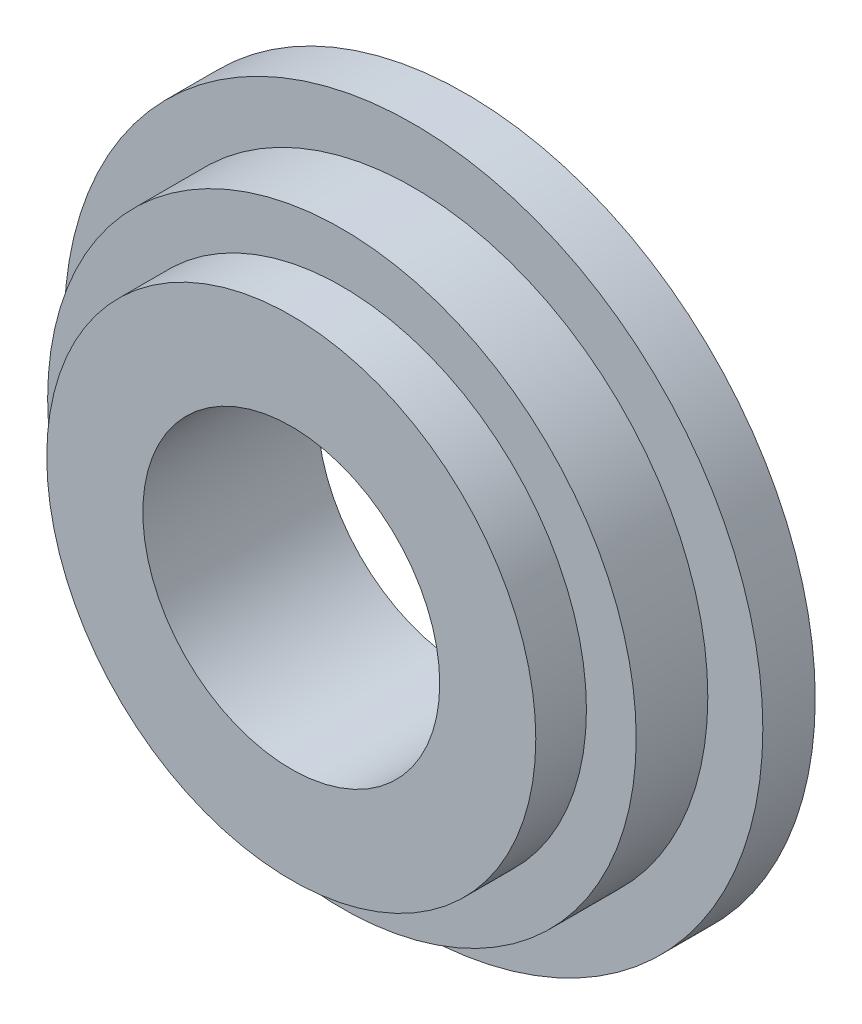
ISO-10303-21;
HEADER;
FILE_DESCRIPTION(('STEP AP214'),'2;1');
FILE_NAME('part.step','',(''),(''),'','','');
FILE_SCHEMA(('AUTOMOTIVE_DESIGN { 1 0 10303 214 1 1 1 1 }'));
ENDSEC;
DATA;
#1=APPLICATION_CONTEXT('core data for automotive mechanical design processes');
#2=APPLICATION_PROTOCOL_DEFINITION('international standard','automotive_design',2000,#1);
#3=PRODUCT_CONTEXT('',#1,'mechanical');
#4=PRODUCT('Part','Part','',(#3));
#5=PRODUCT_RELATED_PRODUCT_CATEGORY('part','',(#4));
#6=PRODUCT_DEFINITION_FORMATION('','',#4);
#7=PRODUCT_DEFINITION_CONTEXT('part definition',#1,'design');
#8=PRODUCT_DEFINITION('design','',#6,#7);
#9=PRODUCT_DEFINITION_SHAPE('','',#8);
#10=(LENGTH_UNIT() NAMED_UNIT(*) SI_UNIT(.MILLI.,.METRE.));
#11=(NAMED_UNIT(*) PLANE_ANGLE_UNIT() SI_UNIT($,.RADIAN.));
#12=(NAMED_UNIT(*) SI_UNIT($,.STERADIAN.) SOLID_ANGLE_UNIT());
#13=UNCERTAINTY_MEASURE_WITH_UNIT(LENGTH_MEASURE(1.E-05),#10,'distance_accuracy_value','');
#14=(GEOMETRIC_REPRESENTATION_CONTEXT(3) GLOBAL_UNCERTAINTY_ASSIGNED_CONTEXT((#13)) GLOBAL_UNIT_ASSIGNED_CONTEXT((#10,
#11,#12)) REPRESENTATION_CONTEXT('',''));
#15=CARTESIAN_POINT('',(0.,0.,0.));
#16=DIRECTION('',(0.,0.,1.));
#17=DIRECTION('',(1.,0.,0.));
#18=AXIS2_PLACEMENT_3D('',#15,#16,#17);
#19=CARTESIAN_POINT('',(0.,0.,3.));
#20=DIRECTION('',(0.,0.,-1.));
#21=DIRECTION('',(-1.,0.,0.));
#22=AXIS2_PLACEMENT_3D('',#19,#20,#21);
#23=CYLINDRICAL_SURFACE('',#22,20.);
#24=CARTESIAN_POINT('',(0.,0.,3.));
#25=DIRECTION('',(0.,0.,1.));
#26=DIRECTION('',(1.,0.,0.));
#27=AXIS2_PLACEMENT_3D('',#24,#25,#26);
#28=CIRCLE('',#27,20.);
#29=CARTESIAN_POINT('',(20.,0.,3.));
#30=VERTEX_POINT('',#29);
#31=EDGE_CURVE('E10',#30,#30,#28,.T.);
#32=ORIENTED_EDGE('',*,*,#31,.F.);
#33=EDGE_LOOP('',(#32));
#34=FACE_BOUND('',#33,.T.);
#35=CARTESIAN_POINT('',(0.,0.,0.));
#36=DIRECTION('',(0.,0.,1.));
#37=DIRECTION('',(1.,0.,0.));
#38=AXIS2_PLACEMENT_3D('',#35,#36,#37);
#39=CIRCLE('',#38,20.);
#40=CARTESIAN_POINT('',(20.,0.,0.));
#41=VERTEX_POINT('',#40);
#42=EDGE_CURVE('E38',#41,#41,#39,.T.);
#43=ORIENTED_EDGE('',*,*,#42,.T.);
#44=EDGE_LOOP('',(#43));
#45=FACE_BOUND('',#44,.T.);
#46=ADVANCED_FACE('F35',(#34,#45),#23,.T.);
#47=CARTESIAN_POINT('',(0.,0.,3.));
#48=DIRECTION('',(0.,0.,1.));
#49=DIRECTION('',(1.,0.,0.));
#50=AXIS2_PLACEMENT_3D('',#47,#48,#49);
#51=PLANE('',#50);
#52=CARTESIAN_POINT('',(0.,0.,3.));
#53=DIRECTION('',(0.,0.,1.));
#54=DIRECTION('',(1.,0.,0.));
#55=AXIS2_PLACEMENT_3D('',#52,#53,#54);
#56=CIRCLE('',#55,16.85);
#57=CARTESIAN_POINT('',(16.85,0.,3.));
#58=VERTEX_POINT('',#57);
#59=EDGE_CURVE('E42',#58,#58,#56,.T.);
#60=ORIENTED_EDGE('',*,*,#59,.F.);
#61=EDGE_LOOP('',(#60));
#62=FACE_BOUND('',#61,.T.);
#63=ORIENTED_EDGE('',*,*,#31,.T.);
#64=EDGE_LOOP('',(#63));
#65=FACE_BOUND('',#64,.T.);
#66=ADVANCED_FACE('F83',(#62,#65),#51,.T.);
#67=CARTESIAN_POINT('',(0.,0.,0.));
#68=DIRECTION('',(0.,0.,1.));
#69=DIRECTION('',(1.,0.,0.));
#70=AXIS2_PLACEMENT_3D('',#67,#68,#69);
#71=PLANE('',#70);
#72=ORIENTED_EDGE('',*,*,#42,.F.);
#73=EDGE_LOOP('',(#72));
#74=FACE_BOUND('',#73,.T.);
#75=CARTESIAN_POINT('',(0.,0.,0.));
#76=DIRECTION('',(0.,0.,1.));
#77=DIRECTION('',(1.,0.,0.));
#78=AXIS2_PLACEMENT_3D('',#75,#76,#77);
#79=CIRCLE('',#78,8.5);
#80=CARTESIAN_POINT('',(8.5,0.,0.));
#81=VERTEX_POINT('',#80);
#82=EDGE_CURVE('E55',#81,#81,#79,.T.);
#83=ORIENTED_EDGE('',*,*,#82,.T.);
#84=EDGE_LOOP('',(#83));
#85=FACE_BOUND('',#84,.T.);
#86=ADVANCED_FACE('F88',(#74,#85),#71,.F.);
#87=CARTESIAN_POINT('',(0.,0.,7.1));
#88=DIRECTION('',(0.,0.,-1.));
#89=DIRECTION('',(-1.,0.,0.));
#90=AXIS2_PLACEMENT_3D('',#87,#88,#89);
#91=CYLINDRICAL_SURFACE('',#90,16.85);
#92=ORIENTED_EDGE('',*,*,#59,.T.);
#93=EDGE_LOOP('',(#92));
#94=FACE_BOUND('',#93,.T.);
#95=CARTESIAN_POINT('',(0.,0.,7.1));
#96=DIRECTION('',(0.,0.,1.));
#97=DIRECTION('',(1.,0.,0.));
#98=AXIS2_PLACEMENT_3D('',#95,#96,#97);
#99=CIRCLE('',#98,16.85);
#100=CARTESIAN_POINT('',(16.85,0.,7.1));
#101=VERTEX_POINT('',#100);
#102=EDGE_CURVE('E48',#101,#101,#99,.T.);
#103=ORIENTED_EDGE('',*,*,#102,.F.);
#104=EDGE_LOOP('',(#103));
#105=FACE_BOUND('',#104,.T.);
#106=ADVANCED_FACE('F97',(#94,#105),#91,.T.);
#107=CARTESIAN_POINT('',(0.,0.,7.1));
#108=DIRECTION('',(0.,0.,1.));
#109=DIRECTION('',(1.,0.,0.));
#110=AXIS2_PLACEMENT_3D('',#107,#108,#109);
#111=PLANE('',#110);
#112=CARTESIAN_POINT('',(0.,0.,7.1));
#113=DIRECTION('',(0.,0.,1.));
#114=DIRECTION('',(1.,0.,0.));
#115=AXIS2_PLACEMENT_3D('',#112,#113,#114);
#116=CIRCLE('',#115,14.);
#117=CARTESIAN_POINT('',(14.,0.,7.1));
#118=VERTEX_POINT('',#117);
#119=EDGE_CURVE('E51',#118,#118,#116,.T.);
#120=ORIENTED_EDGE('',*,*,#119,.F.);
#121=EDGE_LOOP('',(#120));
#122=FACE_BOUND('',#121,.T.);
#123=ORIENTED_EDGE('',*,*,#102,.T.);
#124=EDGE_LOOP('',(#123));
#125=FACE_BOUND('',#124,.T.);
#126=ADVANCED_FACE('F80',(#122,#125),#111,.T.);
#127=CARTESIAN_POINT('',(0.,0.,10.));
#128=DIRECTION('',(0.,0.,-1.));
#129=DIRECTION('',(-1.,0.,0.));
#130=AXIS2_PLACEMENT_3D('',#127,#128,#129);
#131=CYLINDRICAL_SURFACE('',#130,8.5);
#132=CARTESIAN_POINT('',(0.,0.,10.));
#133=DIRECTION('',(0.,0.,1.));
#134=DIRECTION('',(1.,0.,0.));
#135=AXIS2_PLACEMENT_3D('',#132,#133,#134);
#136=CIRCLE('',#135,8.5);
#137=CARTESIAN_POINT('',(8.5,0.,10.));
#138=VERTEX_POINT('',#137);
#139=EDGE_CURVE('E58',#138,#138,#136,.T.);
#140=ORIENTED_EDGE('',*,*,#139,.T.);
#141=EDGE_LOOP('',(#140));
#142=FACE_BOUND('',#141,.T.);
#143=ORIENTED_EDGE('',*,*,#82,.F.);
#144=EDGE_LOOP('',(#143));
#145=FACE_BOUND('',#144,.T.);
#146=ADVANCED_FACE('F64',(#142,#145),#131,.F.);
#147=CARTESIAN_POINT('',(0.,0.,10.));
#148=DIRECTION('',(0.,0.,-1.));
#149=DIRECTION('',(-1.,0.,0.));
#150=AXIS2_PLACEMENT_3D('',#147,#148,#149);
#151=CYLINDRICAL_SURFACE('',#150,14.);
#152=ORIENTED_EDGE('',*,*,#119,.T.);
#153=EDGE_LOOP('',(#152));
#154=FACE_BOUND('',#153,.T.);
#155=CARTESIAN_POINT('',(0.,0.,10.));
#156=DIRECTION('',(0.,0.,1.));
#157=DIRECTION('',(1.,0.,0.));
#158=AXIS2_PLACEMENT_3D('',#155,#156,#157);
#159=CIRCLE('',#158,14.);
#160=CARTESIAN_POINT('',(14.,0.,10.));
#161=VERTEX_POINT('',#160);
#162=EDGE_CURVE('E54',#161,#161,#159,.T.);
#163=ORIENTED_EDGE('',*,*,#162,.F.);
#164=EDGE_LOOP('',(#163));
#165=FACE_BOUND('',#164,.T.);
#166=ADVANCED_FACE('F70',(#154,#165),#151,.T.);
#167=CARTESIAN_POINT('',(0.,0.,10.));
#168=DIRECTION('',(0.,0.,1.));
#169=DIRECTION('',(1.,0.,0.));
#170=AXIS2_PLACEMENT_3D('',#167,#168,#169);
#171=PLANE('',#170);
#172=ORIENTED_EDGE('',*,*,#139,.F.);
#173=EDGE_LOOP('',(#172));
#174=FACE_BOUND('',#173,.T.);
#175=ORIENTED_EDGE('',*,*,#162,.T.);
#176=EDGE_LOOP('',(#175));
#177=FACE_BOUND('',#176,.T.);
#178=ADVANCED_FACE('F67',(#174,#177),#171,.T.);
#179=CLOSED_SHELL('',(#46,#66,#86,#106,#126,#146,#166,#178));
#180=MANIFOLD_SOLID_BREP('B2',#179);
#181=ADVANCED_BREP_SHAPE_REPRESENTATION('',(#18,#180),#14);
#182=SHAPE_DEFINITION_REPRESENTATION(#9,#181);
ENDSEC;
END-ISO-10303-21;
